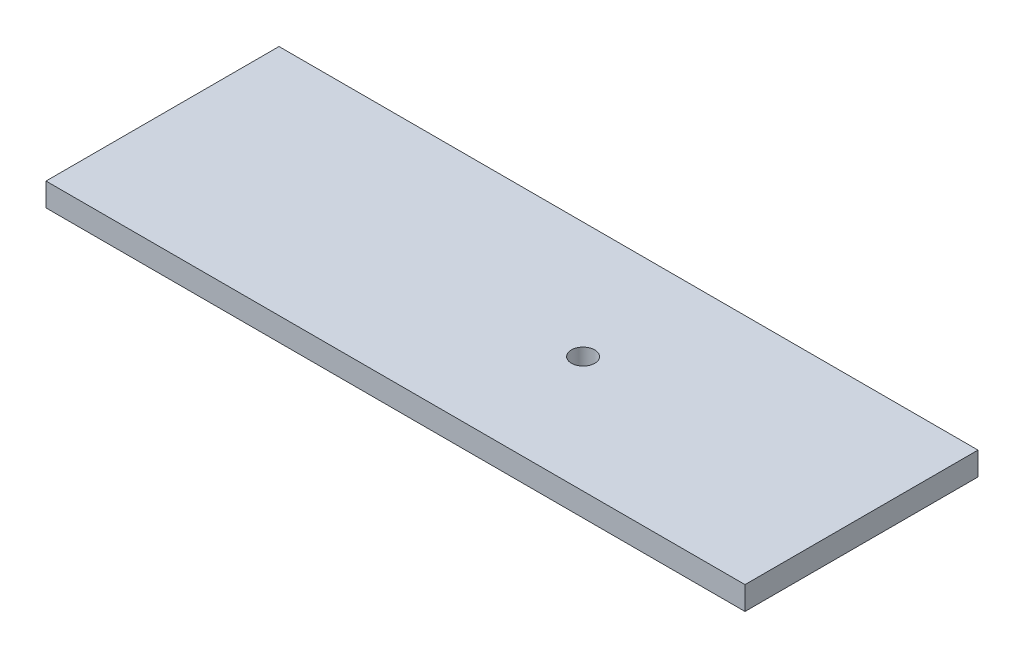
ISO-10303-21;
HEADER;
FILE_DESCRIPTION(('STEP AP214'),'2;1');
FILE_NAME('part.step','',(''),(''),'','','');
FILE_SCHEMA(('AUTOMOTIVE_DESIGN { 1 0 10303 214 1 1 1 1 }'));
ENDSEC;
DATA;
#1=APPLICATION_CONTEXT('core data for automotive mechanical design processes');
#2=APPLICATION_PROTOCOL_DEFINITION('international standard','automotive_design',2000,#1);
#3=PRODUCT_CONTEXT('',#1,'mechanical');
#4=PRODUCT('Part','Part','',(#3));
#5=PRODUCT_RELATED_PRODUCT_CATEGORY('part','',(#4));
#6=PRODUCT_DEFINITION_FORMATION('','',#4);
#7=PRODUCT_DEFINITION_CONTEXT('part definition',#1,'design');
#8=PRODUCT_DEFINITION('design','',#6,#7);
#9=PRODUCT_DEFINITION_SHAPE('','',#8);
#10=(LENGTH_UNIT() NAMED_UNIT(*) SI_UNIT(.MILLI.,.METRE.));
#11=(NAMED_UNIT(*) PLANE_ANGLE_UNIT() SI_UNIT($,.RADIAN.));
#12=(NAMED_UNIT(*) SI_UNIT($,.STERADIAN.) SOLID_ANGLE_UNIT());
#13=UNCERTAINTY_MEASURE_WITH_UNIT(LENGTH_MEASURE(1.E-05),#10,'distance_accuracy_value','');
#14=(GEOMETRIC_REPRESENTATION_CONTEXT(3) GLOBAL_UNCERTAINTY_ASSIGNED_CONTEXT((#13)) GLOBAL_UNIT_ASSIGNED_CONTEXT((#10,
#11,#12)) REPRESENTATION_CONTEXT('',''));
#15=CARTESIAN_POINT('',(0.,0.,0.));
#16=DIRECTION('',(0.,0.,1.));
#17=DIRECTION('',(1.,0.,0.));
#18=AXIS2_PLACEMENT_3D('',#15,#16,#17);
#19=CARTESIAN_POINT('',(0.,10.,0.));
#20=DIRECTION('',(1.,0.,0.));
#21=DIRECTION('',(0.,0.,-1.));
#22=AXIS2_PLACEMENT_3D('',#19,#20,#21);
#23=PLANE('',#22);
#24=DIRECTION('',(0.,0.,1.));
#25=VECTOR('',#24,1.);
#26=CARTESIAN_POINT('',(0.,0.,0.));
#27=LINE('',#26,#25);
#28=CARTESIAN_POINT('',(0.,0.,-100.));
#29=VERTEX_POINT('',#28);
#30=CARTESIAN_POINT('',(0.,0.,0.));
#31=VERTEX_POINT('',#30);
#32=EDGE_CURVE('E96',#29,#31,#27,.T.);
#33=ORIENTED_EDGE('',*,*,#32,.T.);
#34=DIRECTION('',(0.,-1.,0.));
#35=VECTOR('',#34,1.);
#36=CARTESIAN_POINT('',(0.,10.,0.));
#37=LINE('',#36,#35);
#38=CARTESIAN_POINT('',(0.,10.,0.));
#39=VERTEX_POINT('',#38);
#40=EDGE_CURVE('E11',#39,#31,#37,.T.);
#41=ORIENTED_EDGE('',*,*,#40,.F.);
#42=DIRECTION('',(0.,0.,1.));
#43=VECTOR('',#42,1.);
#44=CARTESIAN_POINT('',(0.,10.,0.));
#45=LINE('',#44,#43);
#46=CARTESIAN_POINT('',(0.,10.,-100.));
#47=VERTEX_POINT('',#46);
#48=EDGE_CURVE('E84',#47,#39,#45,.T.);
#49=ORIENTED_EDGE('',*,*,#48,.F.);
#50=DIRECTION('',(0.,-1.,0.));
#51=VECTOR('',#50,1.);
#52=CARTESIAN_POINT('',(0.,10.,-100.));
#53=LINE('',#52,#51);
#54=EDGE_CURVE('E92',#47,#29,#53,.T.);
#55=ORIENTED_EDGE('',*,*,#54,.T.);
#56=EDGE_LOOP('',(#33,#41,#49,#55));
#57=FACE_BOUND('',#56,.T.);
#58=ADVANCED_FACE('F33',(#57),#23,.F.);
#59=CARTESIAN_POINT('',(0.,10.,0.));
#60=DIRECTION('',(0.,0.,-1.));
#61=DIRECTION('',(-1.,0.,0.));
#62=AXIS2_PLACEMENT_3D('',#59,#60,#61);
#63=PLANE('',#62);
#64=DIRECTION('',(1.,0.,0.));
#65=VECTOR('',#64,1.);
#66=CARTESIAN_POINT('',(0.,0.,0.));
#67=LINE('',#66,#65);
#68=CARTESIAN_POINT('',(300.,0.,0.));
#69=VERTEX_POINT('',#68);
#70=EDGE_CURVE('E88',#31,#69,#67,.T.);
#71=ORIENTED_EDGE('',*,*,#70,.T.);
#72=DIRECTION('',(0.,-1.,0.));
#73=VECTOR('',#72,1.);
#74=CARTESIAN_POINT('',(300.,10.,0.));
#75=LINE('',#74,#73);
#76=CARTESIAN_POINT('',(300.,10.,0.));
#77=VERTEX_POINT('',#76);
#78=EDGE_CURVE('E41',#77,#69,#75,.T.);
#79=ORIENTED_EDGE('',*,*,#78,.F.);
#80=DIRECTION('',(1.,0.,0.));
#81=VECTOR('',#80,1.);
#82=CARTESIAN_POINT('',(0.,10.,0.));
#83=LINE('',#82,#81);
#84=EDGE_CURVE('E79',#39,#77,#83,.T.);
#85=ORIENTED_EDGE('',*,*,#84,.F.);
#86=ORIENTED_EDGE('',*,*,#40,.T.);
#87=EDGE_LOOP('',(#71,#79,#85,#86));
#88=FACE_BOUND('',#87,.T.);
#89=ADVANCED_FACE('F87',(#88),#63,.F.);
#90=CARTESIAN_POINT('',(300.,10.,0.));
#91=DIRECTION('',(-1.,0.,0.));
#92=DIRECTION('',(0.,0.,1.));
#93=AXIS2_PLACEMENT_3D('',#90,#91,#92);
#94=PLANE('',#93);
#95=DIRECTION('',(0.,0.,-1.));
#96=VECTOR('',#95,1.);
#97=CARTESIAN_POINT('',(300.,0.,0.));
#98=LINE('',#97,#96);
#99=CARTESIAN_POINT('',(300.,0.,-100.));
#100=VERTEX_POINT('',#99);
#101=EDGE_CURVE('E66',#69,#100,#98,.T.);
#102=ORIENTED_EDGE('',*,*,#101,.T.);
#103=DIRECTION('',(0.,-1.,0.));
#104=VECTOR('',#103,1.);
#105=CARTESIAN_POINT('',(300.,10.,-100.));
#106=LINE('',#105,#104);
#107=CARTESIAN_POINT('',(300.,10.,-100.));
#108=VERTEX_POINT('',#107);
#109=EDGE_CURVE('E89',#108,#100,#106,.T.);
#110=ORIENTED_EDGE('',*,*,#109,.F.);
#111=DIRECTION('',(0.,0.,-1.));
#112=VECTOR('',#111,1.);
#113=CARTESIAN_POINT('',(300.,10.,0.));
#114=LINE('',#113,#112);
#115=EDGE_CURVE('E82',#77,#108,#114,.T.);
#116=ORIENTED_EDGE('',*,*,#115,.F.);
#117=ORIENTED_EDGE('',*,*,#78,.T.);
#118=EDGE_LOOP('',(#102,#110,#116,#117));
#119=FACE_BOUND('',#118,.T.);
#120=ADVANCED_FACE('F90',(#119),#94,.F.);
#121=CARTESIAN_POINT('',(0.,10.,-100.));
#122=DIRECTION('',(0.,0.,1.));
#123=DIRECTION('',(1.,0.,0.));
#124=AXIS2_PLACEMENT_3D('',#121,#122,#123);
#125=PLANE('',#124);
#126=DIRECTION('',(-1.,0.,0.));
#127=VECTOR('',#126,1.);
#128=CARTESIAN_POINT('',(0.,0.,-100.));
#129=LINE('',#128,#127);
#130=EDGE_CURVE('E72',#100,#29,#129,.T.);
#131=ORIENTED_EDGE('',*,*,#130,.T.);
#132=ORIENTED_EDGE('',*,*,#54,.F.);
#133=DIRECTION('',(-1.,0.,0.));
#134=VECTOR('',#133,1.);
#135=CARTESIAN_POINT('',(0.,10.,-100.));
#136=LINE('',#135,#134);
#137=EDGE_CURVE('E49',#108,#47,#136,.T.);
#138=ORIENTED_EDGE('',*,*,#137,.F.);
#139=ORIENTED_EDGE('',*,*,#109,.T.);
#140=EDGE_LOOP('',(#131,#132,#138,#139));
#141=FACE_BOUND('',#140,.T.);
#142=ADVANCED_FACE('F104',(#141),#125,.F.);
#143=CARTESIAN_POINT('',(0.,10.,0.));
#144=DIRECTION('',(0.,-1.,0.));
#145=DIRECTION('',(0.,0.,-1.));
#146=AXIS2_PLACEMENT_3D('',#143,#144,#145);
#147=PLANE('',#146);
#148=CARTESIAN_POINT('',(180.5,10.,-50.));
#149=DIRECTION('',(0.,1.,0.));
#150=DIRECTION('',(0.,0.,1.));
#151=AXIS2_PLACEMENT_3D('',#148,#149,#150);
#152=CIRCLE('',#151,4.99999999999999);
#153=CARTESIAN_POINT('',(180.5,10.,-45.));
#154=VERTEX_POINT('',#153);
#155=EDGE_CURVE('E110',#154,#154,#152,.T.);
#156=ORIENTED_EDGE('',*,*,#155,.F.);
#157=EDGE_LOOP('',(#156));
#158=FACE_BOUND('',#157,.T.);
#159=ORIENTED_EDGE('',*,*,#48,.T.);
#160=ORIENTED_EDGE('',*,*,#84,.T.);
#161=ORIENTED_EDGE('',*,*,#115,.T.);
#162=ORIENTED_EDGE('',*,*,#137,.T.);
#163=EDGE_LOOP('',(#159,#160,#161,#162));
#164=FACE_BOUND('',#163,.T.);
#165=ADVANCED_FACE('F80',(#158,#164),#147,.F.);
#166=CARTESIAN_POINT('',(0.,0.,0.));
#167=DIRECTION('',(0.,-1.,0.));
#168=DIRECTION('',(0.,0.,-1.));
#169=AXIS2_PLACEMENT_3D('',#166,#167,#168);
#170=PLANE('',#169);
#171=CARTESIAN_POINT('',(180.5,0.,-50.));
#172=DIRECTION('',(0.,1.,0.));
#173=DIRECTION('',(0.,0.,1.));
#174=AXIS2_PLACEMENT_3D('',#171,#172,#173);
#175=CIRCLE('',#174,4.99999999999999);
#176=CARTESIAN_POINT('',(180.5,0.,-45.));
#177=VERTEX_POINT('',#176);
#178=EDGE_CURVE('E99',#177,#177,#175,.T.);
#179=ORIENTED_EDGE('',*,*,#178,.T.);
#180=EDGE_LOOP('',(#179));
#181=FACE_BOUND('',#180,.T.);
#182=ORIENTED_EDGE('',*,*,#32,.F.);
#183=ORIENTED_EDGE('',*,*,#130,.F.);
#184=ORIENTED_EDGE('',*,*,#101,.F.);
#185=ORIENTED_EDGE('',*,*,#70,.F.);
#186=EDGE_LOOP('',(#182,#183,#184,#185));
#187=FACE_BOUND('',#186,.T.);
#188=ADVANCED_FACE('F107',(#181,#187),#170,.T.);
#189=CARTESIAN_POINT('',(180.5,0.,-50.));
#190=DIRECTION('',(0.,1.,0.));
#191=DIRECTION('',(0.,0.,1.));
#192=AXIS2_PLACEMENT_3D('',#189,#190,#191);
#193=CYLINDRICAL_SURFACE('',#192,4.99999999999999);
#194=ORIENTED_EDGE('',*,*,#178,.F.);
#195=EDGE_LOOP('',(#194));
#196=FACE_BOUND('',#195,.T.);
#197=ORIENTED_EDGE('',*,*,#155,.T.);
#198=EDGE_LOOP('',(#197));
#199=FACE_BOUND('',#198,.T.);
#200=ADVANCED_FACE('F117',(#196,#199),#193,.F.);
#201=CLOSED_SHELL('',(#58,#89,#120,#142,#165,#188,#200));
#202=MANIFOLD_SOLID_BREP('B2',#201);
#203=ADVANCED_BREP_SHAPE_REPRESENTATION('',(#18,#202),#14);
#204=SHAPE_DEFINITION_REPRESENTATION(#9,#203);
ENDSEC;
END-ISO-10303-21;
